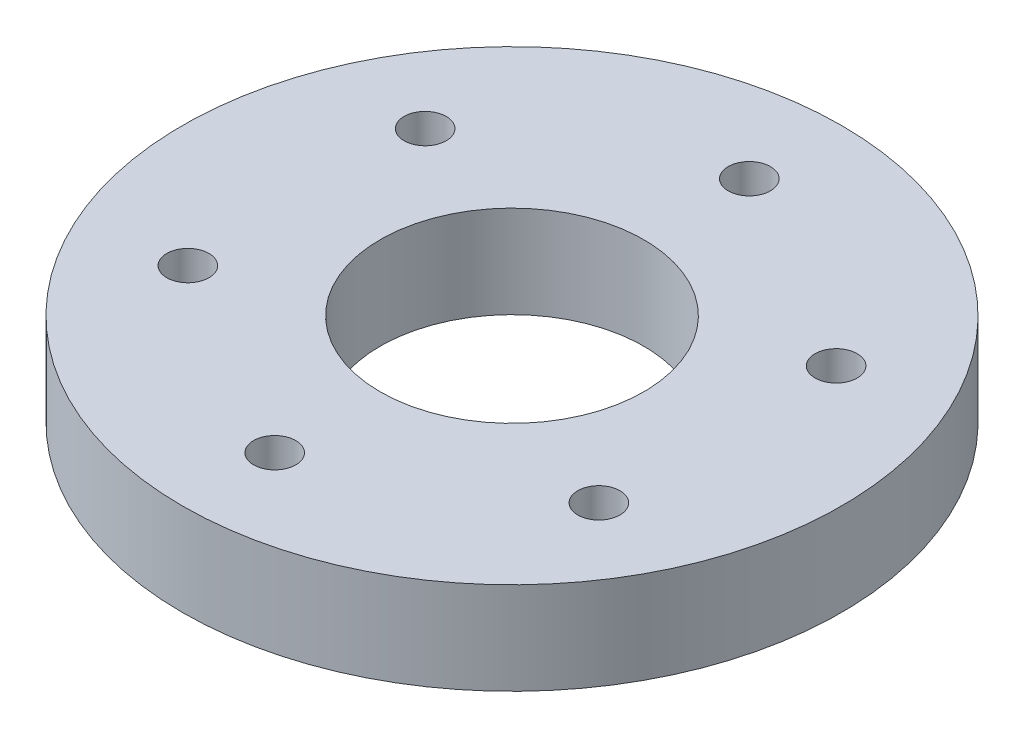
ISO-10303-21;
HEADER;
FILE_DESCRIPTION(('STEP AP214'),'2;1');
FILE_NAME('part.step','',(''),(''),'','','');
FILE_SCHEMA(('AUTOMOTIVE_DESIGN { 1 0 10303 214 1 1 1 1 }'));
ENDSEC;
DATA;
#1=APPLICATION_CONTEXT('core data for automotive mechanical design processes');
#2=APPLICATION_PROTOCOL_DEFINITION('international standard','automotive_design',2000,#1);
#3=PRODUCT_CONTEXT('',#1,'mechanical');
#4=PRODUCT('Part','Part','',(#3));
#5=PRODUCT_RELATED_PRODUCT_CATEGORY('part','',(#4));
#6=PRODUCT_DEFINITION_FORMATION('','',#4);
#7=PRODUCT_DEFINITION_CONTEXT('part definition',#1,'design');
#8=PRODUCT_DEFINITION('design','',#6,#7);
#9=PRODUCT_DEFINITION_SHAPE('','',#8);
#10=(LENGTH_UNIT() NAMED_UNIT(*) SI_UNIT(.MILLI.,.METRE.));
#11=(NAMED_UNIT(*) PLANE_ANGLE_UNIT() SI_UNIT($,.RADIAN.));
#12=(NAMED_UNIT(*) SI_UNIT($,.STERADIAN.) SOLID_ANGLE_UNIT());
#13=UNCERTAINTY_MEASURE_WITH_UNIT(LENGTH_MEASURE(1.E-05),#10,'distance_accuracy_value','');
#14=(GEOMETRIC_REPRESENTATION_CONTEXT(3) GLOBAL_UNCERTAINTY_ASSIGNED_CONTEXT((#13)) GLOBAL_UNIT_ASSIGNED_CONTEXT((#10,
#11,#12)) REPRESENTATION_CONTEXT('',''));
#15=CARTESIAN_POINT('',(0.,0.,0.));
#16=DIRECTION('',(0.,0.,1.));
#17=DIRECTION('',(1.,0.,0.));
#18=AXIS2_PLACEMENT_3D('',#15,#16,#17);
#19=CARTESIAN_POINT('',(15.5884572681203,7.,-9.00000000000067));
#20=DIRECTION('',(0.,1.,0.));
#21=DIRECTION('',(0.,0.,1.));
#22=AXIS2_PLACEMENT_3D('',#19,#20,#21);
#23=CYLINDRICAL_SURFACE('',#22,1.60000000000022);
#24=CARTESIAN_POINT('',(15.5884572681203,17.,-9.00000000000067));
#25=DIRECTION('',(0.,1.,0.));
#26=DIRECTION('',(0.,0.,1.));
#27=AXIS2_PLACEMENT_3D('',#24,#25,#26);
#28=CIRCLE('',#27,1.60000000000022);
#29=CARTESIAN_POINT('',(15.5884572681203,17.,-7.40000000000045));
#30=VERTEX_POINT('',#29);
#31=EDGE_CURVE('E136',#30,#30,#28,.T.);
#32=ORIENTED_EDGE('',*,*,#31,.T.);
#33=EDGE_LOOP('',(#32));
#34=FACE_BOUND('',#33,.T.);
#35=CARTESIAN_POINT('',(15.5884572681203,12.,-9.00000000000067));
#36=DIRECTION('',(0.,-1.,0.));
#37=DIRECTION('',(0.,0.,-1.));
#38=AXIS2_PLACEMENT_3D('',#35,#36,#37);
#39=CIRCLE('',#38,1.60000000000022);
#40=CARTESIAN_POINT('',(15.5884572681203,12.,-10.6000000000009));
#41=VERTEX_POINT('',#40);
#42=EDGE_CURVE('E37',#41,#41,#39,.F.);
#43=ORIENTED_EDGE('',*,*,#42,.F.);
#44=EDGE_LOOP('',(#43));
#45=FACE_BOUND('',#44,.T.);
#46=ADVANCED_FACE('F33',(#34,#45),#23,.F.);
#47=CARTESIAN_POINT('',(1.52815921652642E-12,7.,18.));
#48=DIRECTION('',(0.,1.,0.));
#49=DIRECTION('',(0.,0.,1.));
#50=AXIS2_PLACEMENT_3D('',#47,#48,#49);
#51=CYLINDRICAL_SURFACE('',#50,1.60000000000158);
#52=CARTESIAN_POINT('',(1.52815921652642E-12,17.,18.));
#53=DIRECTION('',(0.,1.,0.));
#54=DIRECTION('',(0.,0.,1.));
#55=AXIS2_PLACEMENT_3D('',#52,#53,#54);
#56=CIRCLE('',#55,1.60000000000158);
#57=CARTESIAN_POINT('',(1.52815921652642E-12,17.,19.6000000000016));
#58=VERTEX_POINT('',#57);
#59=EDGE_CURVE('E150',#58,#58,#56,.T.);
#60=ORIENTED_EDGE('',*,*,#59,.T.);
#61=EDGE_LOOP('',(#60));
#62=FACE_BOUND('',#61,.T.);
#63=CARTESIAN_POINT('',(1.52815921652642E-12,12.,18.));
#64=DIRECTION('',(0.,-1.,0.));
#65=DIRECTION('',(0.,0.,-1.));
#66=AXIS2_PLACEMENT_3D('',#63,#64,#65);
#67=CIRCLE('',#66,1.60000000000158);
#68=CARTESIAN_POINT('',(1.52815921652642E-12,12.,16.3999999999984));
#69=VERTEX_POINT('',#68);
#70=EDGE_CURVE('E60',#69,#69,#67,.F.);
#71=ORIENTED_EDGE('',*,*,#70,.F.);
#72=EDGE_LOOP('',(#71));
#73=FACE_BOUND('',#72,.T.);
#74=ADVANCED_FACE('F71',(#62,#73),#51,.F.);
#75=CARTESIAN_POINT('',(-15.5884572681195,7.,-8.99999999999933));
#76=DIRECTION('',(0.,1.,0.));
#77=DIRECTION('',(0.,0.,1.));
#78=AXIS2_PLACEMENT_3D('',#75,#76,#77);
#79=CYLINDRICAL_SURFACE('',#78,1.60000000000077);
#80=CARTESIAN_POINT('',(-15.5884572681195,17.,-8.99999999999933));
#81=DIRECTION('',(0.,1.,0.));
#82=DIRECTION('',(0.,0.,1.));
#83=AXIS2_PLACEMENT_3D('',#80,#81,#82);
#84=CIRCLE('',#83,1.60000000000077);
#85=CARTESIAN_POINT('',(-15.5884572681195,17.,-7.39999999999855));
#86=VERTEX_POINT('',#85);
#87=EDGE_CURVE('E144',#86,#86,#84,.T.);
#88=ORIENTED_EDGE('',*,*,#87,.T.);
#89=EDGE_LOOP('',(#88));
#90=FACE_BOUND('',#89,.T.);
#91=CARTESIAN_POINT('',(-15.5884572681195,12.,-8.99999999999933));
#92=DIRECTION('',(0.,-1.,0.));
#93=DIRECTION('',(0.,0.,-1.));
#94=AXIS2_PLACEMENT_3D('',#91,#92,#93);
#95=CIRCLE('',#94,1.60000000000077);
#96=CARTESIAN_POINT('',(-15.5884572681195,12.,-10.6000000000001));
#97=VERTEX_POINT('',#96);
#98=EDGE_CURVE('E58',#97,#97,#95,.F.);
#99=ORIENTED_EDGE('',*,*,#98,.F.);
#100=EDGE_LOOP('',(#99));
#101=FACE_BOUND('',#100,.T.);
#102=ADVANCED_FACE('F77',(#90,#101),#79,.F.);
#103=CARTESIAN_POINT('',(0.,17.,0.));
#104=DIRECTION('',(0.,-1.,0.));
#105=DIRECTION('',(0.,0.,-1.));
#106=AXIS2_PLACEMENT_3D('',#103,#104,#105);
#107=CYLINDRICAL_SURFACE('',#106,25.);
#108=CARTESIAN_POINT('',(0.,17.,0.));
#109=DIRECTION('',(0.,1.,0.));
#110=DIRECTION('',(0.,0.,1.));
#111=AXIS2_PLACEMENT_3D('',#108,#109,#110);
#112=CIRCLE('',#111,25.);
#113=CARTESIAN_POINT('',(0.,17.,-25.));
#114=VERTEX_POINT('',#113);
#115=EDGE_CURVE('E10',#114,#114,#112,.T.);
#116=CARTESIAN_POINT('',(0.,10.,0.));
#117=DIRECTION('',(0.,1.,0.));
#118=DIRECTION('',(0.,0.,1.));
#119=AXIS2_PLACEMENT_3D('',#116,#117,#118);
#120=CIRCLE('',#119,25.);
#121=CARTESIAN_POINT('',(0.,10.,-25.));
#122=VERTEX_POINT('',#121);
#123=EDGE_CURVE('E41',#122,#122,#120,.T.);
#124=CARTESIAN_POINT('',(0.,17.,-25.));
#125=CARTESIAN_POINT('',(0.,16.9270833333333,-25.));
#126=CARTESIAN_POINT('',(0.,16.8541666666667,-25.));
#127=CARTESIAN_POINT('',(0.,16.7083333333333,-25.));
#128=CARTESIAN_POINT('',(0.,16.6354166666667,-25.));
#129=CARTESIAN_POINT('',(0.,16.4895833333333,-25.));
#130=CARTESIAN_POINT('',(0.,16.4166666666667,-25.));
#131=CARTESIAN_POINT('',(0.,16.2708333333333,-25.));
#132=CARTESIAN_POINT('',(0.,16.1979166666667,-25.));
#133=CARTESIAN_POINT('',(0.,16.0520833333333,-25.));
#134=CARTESIAN_POINT('',(0.,15.9791666666667,-25.));
#135=CARTESIAN_POINT('',(0.,15.8333333333333,-25.));
#136=CARTESIAN_POINT('',(0.,15.7604166666667,-25.));
#137=CARTESIAN_POINT('',(0.,15.6145833333333,-25.));
#138=CARTESIAN_POINT('',(0.,15.5416666666667,-25.));
#139=CARTESIAN_POINT('',(0.,15.3958333333333,-25.));
#140=CARTESIAN_POINT('',(0.,15.3229166666667,-25.));
#141=CARTESIAN_POINT('',(0.,15.1770833333333,-25.));
#142=CARTESIAN_POINT('',(0.,15.1041666666667,-25.));
#143=CARTESIAN_POINT('',(0.,14.9583333333333,-25.));
#144=CARTESIAN_POINT('',(0.,14.8854166666667,-25.));
#145=CARTESIAN_POINT('',(0.,14.7395833333333,-25.));
#146=CARTESIAN_POINT('',(0.,14.6666666666667,-25.));
#147=CARTESIAN_POINT('',(0.,14.5208333333333,-25.));
#148=CARTESIAN_POINT('',(0.,14.4479166666667,-25.));
#149=CARTESIAN_POINT('',(0.,14.3020833333333,-25.));
#150=CARTESIAN_POINT('',(0.,14.2291666666667,-25.));
#151=CARTESIAN_POINT('',(0.,14.0833333333333,-25.));
#152=CARTESIAN_POINT('',(0.,14.0104166666667,-25.));
#153=CARTESIAN_POINT('',(0.,13.8645833333333,-25.));
#154=CARTESIAN_POINT('',(0.,13.7916666666667,-25.));
#155=CARTESIAN_POINT('',(0.,13.6458333333333,-25.));
#156=CARTESIAN_POINT('',(0.,13.5729166666667,-25.));
#157=CARTESIAN_POINT('',(0.,13.4270833333333,-25.));
#158=CARTESIAN_POINT('',(0.,13.3541666666667,-25.));
#159=CARTESIAN_POINT('',(0.,13.2083333333333,-25.));
#160=CARTESIAN_POINT('',(0.,13.1354166666667,-25.));
#161=CARTESIAN_POINT('',(0.,12.9895833333333,-25.));
#162=CARTESIAN_POINT('',(0.,12.9166666666667,-25.));
#163=CARTESIAN_POINT('',(0.,12.7708333333333,-25.));
#164=CARTESIAN_POINT('',(0.,12.6979166666667,-25.));
#165=CARTESIAN_POINT('',(0.,12.5520833333333,-25.));
#166=CARTESIAN_POINT('',(0.,12.4791666666667,-25.));
#167=CARTESIAN_POINT('',(0.,12.3333333333333,-25.));
#168=CARTESIAN_POINT('',(0.,12.2604166666667,-25.));
#169=CARTESIAN_POINT('',(0.,12.1145833333333,-25.));
#170=CARTESIAN_POINT('',(0.,12.0416666666667,-25.));
#171=CARTESIAN_POINT('',(0.,11.8958333333333,-25.));
#172=CARTESIAN_POINT('',(0.,11.8229166666667,-25.));
#173=CARTESIAN_POINT('',(0.,11.6770833333333,-25.));
#174=CARTESIAN_POINT('',(0.,11.6041666666667,-25.));
#175=CARTESIAN_POINT('',(0.,11.4583333333333,-25.));
#176=CARTESIAN_POINT('',(0.,11.3854166666667,-25.));
#177=CARTESIAN_POINT('',(0.,11.2395833333333,-25.));
#178=CARTESIAN_POINT('',(0.,11.1666666666667,-25.));
#179=CARTESIAN_POINT('',(0.,11.0208333333333,-25.));
#180=CARTESIAN_POINT('',(0.,10.9479166666667,-25.));
#181=CARTESIAN_POINT('',(0.,10.8020833333333,-25.));
#182=CARTESIAN_POINT('',(0.,10.7291666666667,-25.));
#183=CARTESIAN_POINT('',(0.,10.5833333333333,-25.));
#184=CARTESIAN_POINT('',(0.,10.5104166666667,-25.));
#185=CARTESIAN_POINT('',(0.,10.3645833333333,-25.));
#186=CARTESIAN_POINT('',(0.,10.2916666666667,-25.));
#187=CARTESIAN_POINT('',(0.,10.1458333333333,-25.));
#188=CARTESIAN_POINT('',(0.,10.0729166666667,-25.));
#189=CARTESIAN_POINT('',(0.,10.,-25.));
#190=B_SPLINE_CURVE_WITH_KNOTS('',3,(#124,#125,#126,#127,#128,#129,#130,#131,#132,#133,#134,
#135,#136,#137,#138,#139,#140,#141,#142,#143,#144,#145,#146,#147,#148,#149,#150,#151,#152,#153,
#154,#155,#156,#157,#158,#159,#160,#161,#162,#163,#164,#165,#166,#167,#168,#169,#170,#171,#172,
#173,#174,#175,#176,#177,#178,#179,#180,#181,#182,#183,#184,#185,#186,#187,#188,#189),
.UNSPECIFIED.,.F.,.F.,(4,2,2,2,2,2,2,2,2,2,2,2,2,2,2,2,2,2,2,2,2,2,2,2,2,2,2,2,2,2,2,2,4),(0.,
0.21875,0.4375,0.656250000000001,0.875000000000001,1.09375,1.3125,1.53125,1.75,1.96875,2.1875,
2.40625,2.625,2.84375,3.0625,3.28125,3.5,3.71875,3.9375,4.15625,4.375,4.59375,4.8125,5.03125,
5.25,5.46875,5.6875,5.90625,6.125,6.34375,6.5625,6.78125,7.),.UNSPECIFIED.);
#191=EDGE_CURVE('BSEAM35',#114,#122,#190,.T.);
#192=ORIENTED_EDGE('',*,*,#115,.F.);
#193=ORIENTED_EDGE('',*,*,#123,.T.);
#194=ORIENTED_EDGE('',*,*,#191,.T.);
#195=ORIENTED_EDGE('',*,*,#191,.F.);
#196=EDGE_LOOP('',(#192,#194,#193,#195));
#197=FACE_BOUND('',#196,.T.);
#198=ADVANCED_FACE('F35',(#197),#107,.T.);
#199=CARTESIAN_POINT('',(0.,17.,0.));
#200=DIRECTION('',(0.,1.,0.));
#201=DIRECTION('',(0.,0.,1.));
#202=AXIS2_PLACEMENT_3D('',#199,#200,#201);
#203=PLANE('',#202);
#204=CARTESIAN_POINT('',(0.,17.,-18.));
#205=DIRECTION('',(0.,1.,0.));
#206=DIRECTION('',(0.,0.,1.));
#207=AXIS2_PLACEMENT_3D('',#204,#205,#206);
#208=CIRCLE('',#207,1.6);
#209=CARTESIAN_POINT('',(0.,17.,-16.4));
#210=VERTEX_POINT('',#209);
#211=EDGE_CURVE('E135',#210,#210,#208,.T.);
#212=ORIENTED_EDGE('',*,*,#211,.F.);
#213=EDGE_LOOP('',(#212));
#214=FACE_BOUND('',#213,.T.);
#215=ORIENTED_EDGE('',*,*,#87,.F.);
#216=EDGE_LOOP('',(#215));
#217=FACE_BOUND('',#216,.T.);
#218=CARTESIAN_POINT('',(-15.5884572681187,17.,9.00000000000067));
#219=DIRECTION('',(0.,1.,0.));
#220=DIRECTION('',(0.,0.,1.));
#221=AXIS2_PLACEMENT_3D('',#218,#219,#220);
#222=CIRCLE('',#221,1.60000000000146);
#223=CARTESIAN_POINT('',(-15.5884572681187,17.,10.6000000000021));
#224=VERTEX_POINT('',#223);
#225=EDGE_CURVE('E146',#224,#224,#222,.T.);
#226=ORIENTED_EDGE('',*,*,#225,.F.);
#227=EDGE_LOOP('',(#226));
#228=FACE_BOUND('',#227,.T.);
#229=ORIENTED_EDGE('',*,*,#59,.F.);
#230=EDGE_LOOP('',(#229));
#231=FACE_BOUND('',#230,.T.);
#232=CARTESIAN_POINT('',(15.588457268121,17.,8.99999999999934));
#233=DIRECTION('',(0.,1.,0.));
#234=DIRECTION('',(0.,0.,1.));
#235=AXIS2_PLACEMENT_3D('',#232,#233,#234);
#236=CIRCLE('',#235,1.60000000000099);
#237=CARTESIAN_POINT('',(15.588457268121,17.,10.6000000000003));
#238=VERTEX_POINT('',#237);
#239=EDGE_CURVE('E139',#238,#238,#236,.T.);
#240=ORIENTED_EDGE('',*,*,#239,.F.);
#241=EDGE_LOOP('',(#240));
#242=FACE_BOUND('',#241,.T.);
#243=ORIENTED_EDGE('',*,*,#31,.F.);
#244=EDGE_LOOP('',(#243));
#245=FACE_BOUND('',#244,.T.);
#246=CARTESIAN_POINT('',(0.,17.,0.));
#247=DIRECTION('',(0.,1.,0.));
#248=DIRECTION('',(0.,0.,1.));
#249=AXIS2_PLACEMENT_3D('',#246,#247,#248);
#250=CIRCLE('',#249,10.);
#251=CARTESIAN_POINT('',(0.,17.,10.));
#252=VERTEX_POINT('',#251);
#253=EDGE_CURVE('E49',#252,#252,#250,.T.);
#254=ORIENTED_EDGE('',*,*,#253,.F.);
#255=EDGE_LOOP('',(#254));
#256=FACE_BOUND('',#255,.T.);
#257=ORIENTED_EDGE('',*,*,#115,.T.);
#258=EDGE_LOOP('',(#257));
#259=FACE_BOUND('',#258,.T.);
#260=ADVANCED_FACE('F98',(#214,#217,#228,#231,#242,#245,#256,#259),#203,.T.);
#261=CARTESIAN_POINT('',(0.,10.,0.));
#262=DIRECTION('',(0.,1.,0.));
#263=DIRECTION('',(0.,0.,1.));
#264=AXIS2_PLACEMENT_3D('',#261,#262,#263);
#265=PLANE('',#264);
#266=CARTESIAN_POINT('',(1.52815921652642E-12,10.,18.));
#267=DIRECTION('',(0.,-1.,0.));
#268=DIRECTION('',(0.,0.,-1.));
#269=AXIS2_PLACEMENT_3D('',#266,#267,#268);
#270=CIRCLE('',#269,3.);
#271=CARTESIAN_POINT('',(1.52815921652642E-12,10.,15.));
#272=VERTEX_POINT('',#271);
#273=EDGE_CURVE('E108',#272,#272,#270,.T.);
#274=ORIENTED_EDGE('',*,*,#273,.F.);
#275=EDGE_LOOP('',(#274));
#276=FACE_BOUND('',#275,.T.);
#277=CARTESIAN_POINT('',(-15.5884572681195,10.,-8.99999999999933));
#278=DIRECTION('',(0.,-1.,0.));
#279=DIRECTION('',(0.,0.,-1.));
#280=AXIS2_PLACEMENT_3D('',#277,#278,#279);
#281=CIRCLE('',#280,3.);
#282=CARTESIAN_POINT('',(-15.5884572681195,10.,-11.9999999999993));
#283=VERTEX_POINT('',#282);
#284=EDGE_CURVE('E112',#283,#283,#281,.T.);
#285=ORIENTED_EDGE('',*,*,#284,.F.);
#286=EDGE_LOOP('',(#285));
#287=FACE_BOUND('',#286,.T.);
#288=CARTESIAN_POINT('',(15.5884572681203,10.,-9.00000000000067));
#289=DIRECTION('',(0.,-1.,0.));
#290=DIRECTION('',(0.,0.,-1.));
#291=AXIS2_PLACEMENT_3D('',#288,#289,#290);
#292=CIRCLE('',#291,3.);
#293=CARTESIAN_POINT('',(15.5884572681203,10.,-12.0000000000007));
#294=VERTEX_POINT('',#293);
#295=EDGE_CURVE('E116',#294,#294,#292,.T.);
#296=ORIENTED_EDGE('',*,*,#295,.F.);
#297=EDGE_LOOP('',(#296));
#298=FACE_BOUND('',#297,.T.);
#299=ORIENTED_EDGE('',*,*,#123,.F.);
#300=EDGE_LOOP('',(#299));
#301=FACE_BOUND('',#300,.T.);
#302=CARTESIAN_POINT('',(0.,10.,0.));
#303=DIRECTION('',(0.,1.,0.));
#304=DIRECTION('',(0.,0.,1.));
#305=AXIS2_PLACEMENT_3D('',#302,#303,#304);
#306=CIRCLE('',#305,10.);
#307=CARTESIAN_POINT('',(0.,10.,10.));
#308=VERTEX_POINT('',#307);
#309=EDGE_CURVE('E46',#308,#308,#306,.T.);
#310=ORIENTED_EDGE('',*,*,#309,.T.);
#311=EDGE_LOOP('',(#310));
#312=FACE_BOUND('',#311,.T.);
#313=CARTESIAN_POINT('',(-15.5884572681187,10.,9.00000000000067));
#314=DIRECTION('',(0.,1.,0.));
#315=DIRECTION('',(0.,0.,1.));
#316=AXIS2_PLACEMENT_3D('',#313,#314,#315);
#317=CIRCLE('',#316,1.60000000000146);
#318=CARTESIAN_POINT('',(-15.5884572681187,10.,10.6000000000021));
#319=VERTEX_POINT('',#318);
#320=EDGE_CURVE('E57',#319,#319,#317,.F.);
#321=ORIENTED_EDGE('',*,*,#320,.F.);
#322=EDGE_LOOP('',(#321));
#323=FACE_BOUND('',#322,.T.);
#324=CARTESIAN_POINT('',(15.588457268121,10.,8.99999999999934));
#325=DIRECTION('',(0.,1.,0.));
#326=DIRECTION('',(0.,0.,1.));
#327=AXIS2_PLACEMENT_3D('',#324,#325,#326);
#328=CIRCLE('',#327,1.60000000000099);
#329=CARTESIAN_POINT('',(15.588457268121,10.,10.6000000000003));
#330=VERTEX_POINT('',#329);
#331=EDGE_CURVE('E127',#330,#330,#328,.F.);
#332=ORIENTED_EDGE('',*,*,#331,.F.);
#333=EDGE_LOOP('',(#332));
#334=FACE_BOUND('',#333,.T.);
#335=CARTESIAN_POINT('',(0.,10.,-18.));
#336=DIRECTION('',(0.,1.,0.));
#337=DIRECTION('',(0.,0.,1.));
#338=AXIS2_PLACEMENT_3D('',#335,#336,#337);
#339=CIRCLE('',#338,1.6);
#340=CARTESIAN_POINT('',(0.,10.,-16.4));
#341=VERTEX_POINT('',#340);
#342=EDGE_CURVE('E54',#341,#341,#339,.F.);
#343=ORIENTED_EDGE('',*,*,#342,.F.);
#344=EDGE_LOOP('',(#343));
#345=FACE_BOUND('',#344,.T.);
#346=ADVANCED_FACE('F96',(#276,#287,#298,#301,#312,#323,#334,#345),#265,.F.);
#347=CARTESIAN_POINT('',(0.,0.,0.));
#348=DIRECTION('',(0.,1.,0.));
#349=DIRECTION('',(0.,0.,1.));
#350=AXIS2_PLACEMENT_3D('',#347,#348,#349);
#351=CYLINDRICAL_SURFACE('',#350,10.);
#352=ORIENTED_EDGE('',*,*,#253,.T.);
#353=EDGE_LOOP('',(#352));
#354=FACE_BOUND('',#353,.T.);
#355=ORIENTED_EDGE('',*,*,#309,.F.);
#356=EDGE_LOOP('',(#355));
#357=FACE_BOUND('',#356,.T.);
#358=ADVANCED_FACE('F87',(#354,#357),#351,.F.);
#359=CARTESIAN_POINT('',(15.588457268121,7.,8.99999999999934));
#360=DIRECTION('',(0.,1.,0.));
#361=DIRECTION('',(0.,0.,1.));
#362=AXIS2_PLACEMENT_3D('',#359,#360,#361);
#363=CYLINDRICAL_SURFACE('',#362,1.60000000000099);
#364=ORIENTED_EDGE('',*,*,#331,.T.);
#365=EDGE_LOOP('',(#364));
#366=FACE_BOUND('',#365,.T.);
#367=ORIENTED_EDGE('',*,*,#239,.T.);
#368=EDGE_LOOP('',(#367));
#369=FACE_BOUND('',#368,.T.);
#370=ADVANCED_FACE('F84',(#366,#369),#363,.F.);
#371=CARTESIAN_POINT('',(-15.5884572681187,7.,9.00000000000067));
#372=DIRECTION('',(0.,1.,0.));
#373=DIRECTION('',(0.,0.,1.));
#374=AXIS2_PLACEMENT_3D('',#371,#372,#373);
#375=CYLINDRICAL_SURFACE('',#374,1.60000000000146);
#376=ORIENTED_EDGE('',*,*,#320,.T.);
#377=EDGE_LOOP('',(#376));
#378=FACE_BOUND('',#377,.T.);
#379=ORIENTED_EDGE('',*,*,#225,.T.);
#380=EDGE_LOOP('',(#379));
#381=FACE_BOUND('',#380,.T.);
#382=ADVANCED_FACE('F86',(#378,#381),#375,.F.);
#383=CARTESIAN_POINT('',(0.,7.,-18.));
#384=DIRECTION('',(0.,1.,0.));
#385=DIRECTION('',(0.,0.,1.));
#386=AXIS2_PLACEMENT_3D('',#383,#384,#385);
#387=CYLINDRICAL_SURFACE('',#386,1.6);
#388=ORIENTED_EDGE('',*,*,#342,.T.);
#389=EDGE_LOOP('',(#388));
#390=FACE_BOUND('',#389,.T.);
#391=ORIENTED_EDGE('',*,*,#211,.T.);
#392=EDGE_LOOP('',(#391));
#393=FACE_BOUND('',#392,.T.);
#394=ADVANCED_FACE('F92',(#390,#393),#387,.F.);
#395=CARTESIAN_POINT('',(-15.5884572681195,12.,-8.99999999999933));
#396=DIRECTION('',(0.,-1.,0.));
#397=DIRECTION('',(0.,0.,-1.));
#398=AXIS2_PLACEMENT_3D('',#395,#396,#397);
#399=PLANE('',#398);
#400=CARTESIAN_POINT('',(-15.5884572681195,12.,-8.99999999999933));
#401=DIRECTION('',(0.,-1.,0.));
#402=DIRECTION('',(0.,0.,-1.));
#403=AXIS2_PLACEMENT_3D('',#400,#401,#402);
#404=CIRCLE('',#403,3.);
#405=CARTESIAN_POINT('',(-15.5884572681195,12.,-11.9999999999993));
#406=VERTEX_POINT('',#405);
#407=EDGE_CURVE('E175',#406,#406,#404,.T.);
#408=ORIENTED_EDGE('',*,*,#407,.T.);
#409=EDGE_LOOP('',(#408));
#410=FACE_BOUND('',#409,.T.);
#411=ORIENTED_EDGE('',*,*,#98,.T.);
#412=EDGE_LOOP('',(#411));
#413=FACE_BOUND('',#412,.T.);
#414=ADVANCED_FACE('F132',(#410,#413),#399,.T.);
#415=CARTESIAN_POINT('',(-15.5884572681195,12.,-8.99999999999933));
#416=DIRECTION('',(0.,-1.,0.));
#417=DIRECTION('',(0.,0.,-1.));
#418=AXIS2_PLACEMENT_3D('',#415,#416,#417);
#419=CYLINDRICAL_SURFACE('',#418,3.);
#420=ORIENTED_EDGE('',*,*,#407,.F.);
#421=EDGE_LOOP('',(#420));
#422=FACE_BOUND('',#421,.T.);
#423=ORIENTED_EDGE('',*,*,#284,.T.);
#424=EDGE_LOOP('',(#423));
#425=FACE_BOUND('',#424,.T.);
#426=ADVANCED_FACE('F195',(#422,#425),#419,.F.);
#427=CARTESIAN_POINT('',(1.52815921652642E-12,12.,18.));
#428=DIRECTION('',(0.,-1.,0.));
#429=DIRECTION('',(0.,0.,-1.));
#430=AXIS2_PLACEMENT_3D('',#427,#428,#429);
#431=PLANE('',#430);
#432=CARTESIAN_POINT('',(1.52815921652642E-12,12.,18.));
#433=DIRECTION('',(0.,-1.,0.));
#434=DIRECTION('',(0.,0.,-1.));
#435=AXIS2_PLACEMENT_3D('',#432,#433,#434);
#436=CIRCLE('',#435,3.);
#437=CARTESIAN_POINT('',(1.52815921652642E-12,12.,15.));
#438=VERTEX_POINT('',#437);
#439=EDGE_CURVE('E61',#438,#438,#436,.T.);
#440=ORIENTED_EDGE('',*,*,#439,.T.);
#441=EDGE_LOOP('',(#440));
#442=FACE_BOUND('',#441,.T.);
#443=ORIENTED_EDGE('',*,*,#70,.T.);
#444=EDGE_LOOP('',(#443));
#445=FACE_BOUND('',#444,.T.);
#446=ADVANCED_FACE('F182',(#442,#445),#431,.T.);
#447=CARTESIAN_POINT('',(1.52815921652642E-12,12.,18.));
#448=DIRECTION('',(0.,-1.,0.));
#449=DIRECTION('',(0.,0.,-1.));
#450=AXIS2_PLACEMENT_3D('',#447,#448,#449);
#451=CYLINDRICAL_SURFACE('',#450,3.);
#452=ORIENTED_EDGE('',*,*,#439,.F.);
#453=EDGE_LOOP('',(#452));
#454=FACE_BOUND('',#453,.T.);
#455=ORIENTED_EDGE('',*,*,#273,.T.);
#456=EDGE_LOOP('',(#455));
#457=FACE_BOUND('',#456,.T.);
#458=ADVANCED_FACE('F184',(#454,#457),#451,.F.);
#459=CARTESIAN_POINT('',(15.5884572681203,12.,-9.00000000000067));
#460=DIRECTION('',(0.,-1.,0.));
#461=DIRECTION('',(0.,0.,-1.));
#462=AXIS2_PLACEMENT_3D('',#459,#460,#461);
#463=PLANE('',#462);
#464=CARTESIAN_POINT('',(15.5884572681203,12.,-9.00000000000067));
#465=DIRECTION('',(0.,-1.,0.));
#466=DIRECTION('',(0.,0.,-1.));
#467=AXIS2_PLACEMENT_3D('',#464,#465,#466);
#468=CIRCLE('',#467,3.);
#469=CARTESIAN_POINT('',(15.5884572681203,12.,-12.0000000000007));
#470=VERTEX_POINT('',#469);
#471=EDGE_CURVE('E171',#470,#470,#468,.T.);
#472=ORIENTED_EDGE('',*,*,#471,.T.);
#473=EDGE_LOOP('',(#472));
#474=FACE_BOUND('',#473,.T.);
#475=ORIENTED_EDGE('',*,*,#42,.T.);
#476=EDGE_LOOP('',(#475));
#477=FACE_BOUND('',#476,.T.);
#478=ADVANCED_FACE('F68',(#474,#477),#463,.T.);
#479=CARTESIAN_POINT('',(15.5884572681203,12.,-9.00000000000067));
#480=DIRECTION('',(0.,-1.,0.));
#481=DIRECTION('',(0.,0.,-1.));
#482=AXIS2_PLACEMENT_3D('',#479,#480,#481);
#483=CYLINDRICAL_SURFACE('',#482,3.);
#484=ORIENTED_EDGE('',*,*,#471,.F.);
#485=EDGE_LOOP('',(#484));
#486=FACE_BOUND('',#485,.T.);
#487=ORIENTED_EDGE('',*,*,#295,.T.);
#488=EDGE_LOOP('',(#487));
#489=FACE_BOUND('',#488,.T.);
#490=ADVANCED_FACE('F192',(#486,#489),#483,.F.);
#491=CLOSED_SHELL('',(#46,#74,#102,#198,#260,#346,#358,#370,#382,#394,#414,#426,#446,#458,#478,#490));
#492=MANIFOLD_SOLID_BREP('B2',#491);
#493=ADVANCED_BREP_SHAPE_REPRESENTATION('',(#18,#492),#14);
#494=SHAPE_DEFINITION_REPRESENTATION(#9,#493);
ENDSEC;
END-ISO-10303-21;
